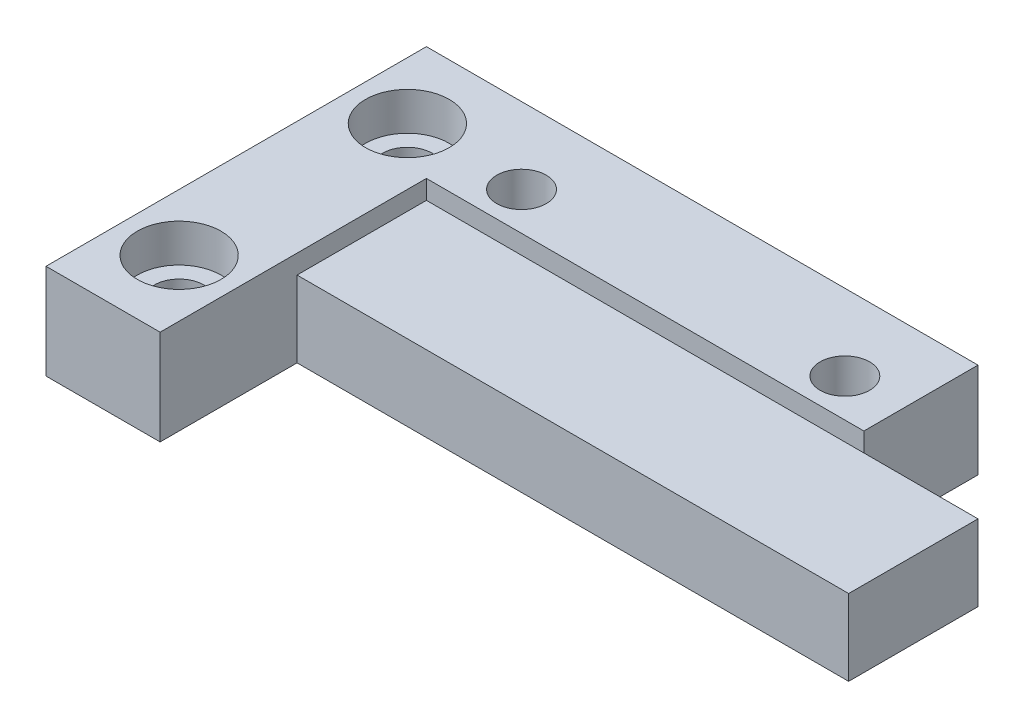
ISO-10303-21;
HEADER;
FILE_DESCRIPTION(('STEP AP214'),'2;1');
FILE_NAME('part.step','',(''),(''),'','','');
FILE_SCHEMA(('AUTOMOTIVE_DESIGN { 1 0 10303 214 1 1 1 1 }'));
ENDSEC;
DATA;
#1=APPLICATION_CONTEXT('core data for automotive mechanical design processes');
#2=APPLICATION_PROTOCOL_DEFINITION('international standard','automotive_design',2000,#1);
#3=PRODUCT_CONTEXT('',#1,'mechanical');
#4=PRODUCT('Part','Part','',(#3));
#5=PRODUCT_RELATED_PRODUCT_CATEGORY('part','',(#4));
#6=PRODUCT_DEFINITION_FORMATION('','',#4);
#7=PRODUCT_DEFINITION_CONTEXT('part definition',#1,'design');
#8=PRODUCT_DEFINITION('design','',#6,#7);
#9=PRODUCT_DEFINITION_SHAPE('','',#8);
#10=(LENGTH_UNIT() NAMED_UNIT(*) SI_UNIT(.MILLI.,.METRE.));
#11=(NAMED_UNIT(*) PLANE_ANGLE_UNIT() SI_UNIT($,.RADIAN.));
#12=(NAMED_UNIT(*) SI_UNIT($,.STERADIAN.) SOLID_ANGLE_UNIT());
#13=UNCERTAINTY_MEASURE_WITH_UNIT(LENGTH_MEASURE(1.E-05),#10,'distance_accuracy_value','');
#14=(GEOMETRIC_REPRESENTATION_CONTEXT(3) GLOBAL_UNCERTAINTY_ASSIGNED_CONTEXT((#13)) GLOBAL_UNIT_ASSIGNED_CONTEXT((#10,
#11,#12)) REPRESENTATION_CONTEXT('',''));
#15=CARTESIAN_POINT('',(0.,0.,0.));
#16=DIRECTION('',(0.,0.,1.));
#17=DIRECTION('',(1.,0.,0.));
#18=AXIS2_PLACEMENT_3D('',#15,#16,#17);
#19=CARTESIAN_POINT('',(3.,5.,-16.));
#20=DIRECTION('',(0.,-1.,0.));
#21=DIRECTION('',(0.,0.,-1.));
#22=AXIS2_PLACEMENT_3D('',#19,#20,#21);
#23=CYLINDRICAL_SURFACE('',#22,1.3);
#24=CARTESIAN_POINT('',(3.,8.,-16.));
#25=DIRECTION('',(0.,-1.,0.));
#26=DIRECTION('',(0.,0.,-1.));
#27=AXIS2_PLACEMENT_3D('',#24,#25,#26);
#28=CIRCLE('',#27,1.3);
#29=CARTESIAN_POINT('',(3.,8.,-17.3));
#30=VERTEX_POINT('',#29);
#31=EDGE_CURVE('E242',#30,#30,#28,.T.);
#32=ORIENTED_EDGE('',*,*,#31,.F.);
#33=EDGE_LOOP('',(#32));
#34=FACE_BOUND('',#33,.T.);
#35=CARTESIAN_POINT('',(3.,5.,-16.));
#36=DIRECTION('',(0.,-1.,0.));
#37=DIRECTION('',(0.,0.,-1.));
#38=AXIS2_PLACEMENT_3D('',#35,#36,#37);
#39=CIRCLE('',#38,1.3);
#40=CARTESIAN_POINT('',(3.,5.,-17.3));
#41=VERTEX_POINT('',#40);
#42=EDGE_CURVE('E338',#41,#41,#39,.T.);
#43=ORIENTED_EDGE('',*,*,#42,.T.);
#44=EDGE_LOOP('',(#43));
#45=FACE_BOUND('',#44,.T.);
#46=ADVANCED_FACE('F33',(#34,#45),#23,.F.);
#47=CARTESIAN_POINT('',(3.,5.,-4.));
#48=DIRECTION('',(0.,-1.,0.));
#49=DIRECTION('',(0.,0.,-1.));
#50=AXIS2_PLACEMENT_3D('',#47,#48,#49);
#51=CYLINDRICAL_SURFACE('',#50,1.3);
#52=CARTESIAN_POINT('',(3.,8.,-4.));
#53=DIRECTION('',(0.,-1.,0.));
#54=DIRECTION('',(0.,0.,-1.));
#55=AXIS2_PLACEMENT_3D('',#52,#53,#54);
#56=CIRCLE('',#55,1.3);
#57=CARTESIAN_POINT('',(3.,8.,-5.3));
#58=VERTEX_POINT('',#57);
#59=EDGE_CURVE('E247',#58,#58,#56,.T.);
#60=ORIENTED_EDGE('',*,*,#59,.F.);
#61=EDGE_LOOP('',(#60));
#62=FACE_BOUND('',#61,.T.);
#63=CARTESIAN_POINT('',(3.,5.,-4.));
#64=DIRECTION('',(0.,-1.,0.));
#65=DIRECTION('',(0.,0.,-1.));
#66=AXIS2_PLACEMENT_3D('',#63,#64,#65);
#67=CIRCLE('',#66,1.3);
#68=CARTESIAN_POINT('',(3.,5.,-5.3));
#69=VERTEX_POINT('',#68);
#70=EDGE_CURVE('E343',#69,#69,#67,.T.);
#71=ORIENTED_EDGE('',*,*,#70,.T.);
#72=EDGE_LOOP('',(#71));
#73=FACE_BOUND('',#72,.T.);
#74=ADVANCED_FACE('F423',(#62,#73),#51,.F.);
#75=CARTESIAN_POINT('',(35.,5.,0.));
#76=DIRECTION('',(-1.,0.,0.));
#77=DIRECTION('',(0.,0.,1.));
#78=AXIS2_PLACEMENT_3D('',#75,#76,#77);
#79=PLANE('',#78);
#80=DIRECTION('',(0.,0.,1.));
#81=VECTOR('',#80,1.);
#82=CARTESIAN_POINT('',(35.,5.,0.));
#83=LINE('',#82,#81);
#84=CARTESIAN_POINT('',(35.,5.,-14.));
#85=VERTEX_POINT('',#84);
#86=CARTESIAN_POINT('',(35.,5.,-7.2));
#87=VERTEX_POINT('',#86);
#88=EDGE_CURVE('E350',#85,#87,#83,.T.);
#89=ORIENTED_EDGE('',*,*,#88,.F.);
#90=DIRECTION('',(0.,-1.,0.));
#91=VECTOR('',#90,1.);
#92=CARTESIAN_POINT('',(35.,5.,-14.));
#93=LINE('',#92,#91);
#94=CARTESIAN_POINT('',(35.,9.,-14.));
#95=VERTEX_POINT('',#94);
#96=EDGE_CURVE('E214',#95,#85,#93,.T.);
#97=ORIENTED_EDGE('',*,*,#96,.F.);
#98=DIRECTION('',(0.,0.,-1.));
#99=VECTOR('',#98,1.);
#100=CARTESIAN_POINT('',(35.,9.,0.));
#101=LINE('',#100,#99);
#102=CARTESIAN_POINT('',(35.,9.,-7.2));
#103=VERTEX_POINT('',#102);
#104=EDGE_CURVE('E287',#103,#95,#101,.T.);
#105=ORIENTED_EDGE('',*,*,#104,.F.);
#106=DIRECTION('',(0.,-1.,0.));
#107=VECTOR('',#106,1.);
#108=CARTESIAN_POINT('',(35.,5.,-7.2));
#109=LINE('',#108,#107);
#110=EDGE_CURVE('E202',#103,#87,#109,.T.);
#111=ORIENTED_EDGE('',*,*,#110,.T.);
#112=EDGE_LOOP('',(#89,#97,#105,#111));
#113=FACE_BOUND('',#112,.T.);
#114=ADVANCED_FACE('F430',(#113),#79,.F.);
#115=CARTESIAN_POINT('',(0.,5.,-20.));
#116=DIRECTION('',(0.,0.,1.));
#117=DIRECTION('',(1.,0.,0.));
#118=AXIS2_PLACEMENT_3D('',#115,#116,#117);
#119=PLANE('',#118);
#120=DIRECTION('',(1.,0.,0.));
#121=VECTOR('',#120,1.);
#122=CARTESIAN_POINT('',(0.,5.,-20.));
#123=LINE('',#122,#121);
#124=CARTESIAN_POINT('',(0.,5.,-20.));
#125=VERTEX_POINT('',#124);
#126=CARTESIAN_POINT('',(29.,5.,-20.));
#127=VERTEX_POINT('',#126);
#128=EDGE_CURVE('E352',#125,#127,#123,.T.);
#129=ORIENTED_EDGE('',*,*,#128,.F.);
#130=DIRECTION('',(0.,-1.,0.));
#131=VECTOR('',#130,1.);
#132=CARTESIAN_POINT('',(0.,5.,-20.));
#133=LINE('',#132,#131);
#134=CARTESIAN_POINT('',(0.,10.,-20.));
#135=VERTEX_POINT('',#134);
#136=EDGE_CURVE('E192',#135,#125,#133,.T.);
#137=ORIENTED_EDGE('',*,*,#136,.F.);
#138=DIRECTION('',(-1.,0.,0.));
#139=VECTOR('',#138,1.);
#140=CARTESIAN_POINT('',(0.,10.,-20.));
#141=LINE('',#140,#139);
#142=CARTESIAN_POINT('',(29.,10.,-20.));
#143=VERTEX_POINT('',#142);
#144=EDGE_CURVE('E267',#143,#135,#141,.T.);
#145=ORIENTED_EDGE('',*,*,#144,.F.);
#146=DIRECTION('',(0.,-1.,0.));
#147=VECTOR('',#146,1.);
#148=CARTESIAN_POINT('',(29.,5.,-20.));
#149=LINE('',#148,#147);
#150=EDGE_CURVE('E208',#143,#127,#149,.T.);
#151=ORIENTED_EDGE('',*,*,#150,.T.);
#152=EDGE_LOOP('',(#129,#137,#145,#151));
#153=FACE_BOUND('',#152,.T.);
#154=ADVANCED_FACE('F454',(#153),#119,.F.);
#155=CARTESIAN_POINT('',(0.,5.,0.));
#156=DIRECTION('',(0.,0.,-1.));
#157=DIRECTION('',(-1.,0.,0.));
#158=AXIS2_PLACEMENT_3D('',#155,#156,#157);
#159=PLANE('',#158);
#160=DIRECTION('',(1.,0.,0.));
#161=VECTOR('',#160,1.);
#162=CARTESIAN_POINT('',(0.,5.,0.));
#163=LINE('',#162,#161);
#164=CARTESIAN_POINT('',(0.,5.,0.));
#165=VERTEX_POINT('',#164);
#166=CARTESIAN_POINT('',(6.,5.,0.));
#167=VERTEX_POINT('',#166);
#168=EDGE_CURVE('E176',#165,#167,#163,.T.);
#169=ORIENTED_EDGE('',*,*,#168,.T.);
#170=DIRECTION('',(0.,-1.,0.));
#171=VECTOR('',#170,1.);
#172=CARTESIAN_POINT('',(6.,1.,0.));
#173=LINE('',#172,#171);
#174=CARTESIAN_POINT('',(6.,10.,0.));
#175=VERTEX_POINT('',#174);
#176=EDGE_CURVE('E198',#175,#167,#173,.T.);
#177=ORIENTED_EDGE('',*,*,#176,.F.);
#178=DIRECTION('',(1.,0.,0.));
#179=VECTOR('',#178,1.);
#180=CARTESIAN_POINT('',(0.,10.,0.));
#181=LINE('',#180,#179);
#182=CARTESIAN_POINT('',(0.,10.,0.));
#183=VERTEX_POINT('',#182);
#184=EDGE_CURVE('E196',#183,#175,#181,.T.);
#185=ORIENTED_EDGE('',*,*,#184,.F.);
#186=DIRECTION('',(0.,-1.,0.));
#187=VECTOR('',#186,1.);
#188=CARTESIAN_POINT('',(0.,5.,0.));
#189=LINE('',#188,#187);
#190=EDGE_CURVE('E41',#183,#165,#189,.T.);
#191=ORIENTED_EDGE('',*,*,#190,.T.);
#192=EDGE_LOOP('',(#169,#177,#185,#191));
#193=FACE_BOUND('',#192,.T.);
#194=ADVANCED_FACE('F194',(#193),#159,.F.);
#195=CARTESIAN_POINT('',(0.,5.,0.));
#196=DIRECTION('',(1.,0.,0.));
#197=DIRECTION('',(0.,0.,-1.));
#198=AXIS2_PLACEMENT_3D('',#195,#196,#197);
#199=PLANE('',#198);
#200=DIRECTION('',(0.,0.,1.));
#201=VECTOR('',#200,1.);
#202=CARTESIAN_POINT('',(0.,5.,0.));
#203=LINE('',#202,#201);
#204=EDGE_CURVE('E179',#125,#165,#203,.T.);
#205=ORIENTED_EDGE('',*,*,#204,.T.);
#206=ORIENTED_EDGE('',*,*,#190,.F.);
#207=DIRECTION('',(0.,0.,1.));
#208=VECTOR('',#207,1.);
#209=CARTESIAN_POINT('',(0.,10.,0.));
#210=LINE('',#209,#208);
#211=EDGE_CURVE('E271',#135,#183,#210,.T.);
#212=ORIENTED_EDGE('',*,*,#211,.F.);
#213=ORIENTED_EDGE('',*,*,#136,.T.);
#214=EDGE_LOOP('',(#205,#206,#212,#213));
#215=FACE_BOUND('',#214,.T.);
#216=ADVANCED_FACE('F35',(#215),#199,.F.);
#217=CARTESIAN_POINT('',(6.,1.,0.));
#218=DIRECTION('',(1.,0.,0.));
#219=DIRECTION('',(0.,0.,-1.));
#220=AXIS2_PLACEMENT_3D('',#217,#218,#219);
#221=PLANE('',#220);
#222=ORIENTED_EDGE('',*,*,#176,.T.);
#223=DIRECTION('',(0.,0.,-1.));
#224=VECTOR('',#223,1.);
#225=CARTESIAN_POINT('',(6.,5.,0.));
#226=LINE('',#225,#224);
#227=CARTESIAN_POINT('',(6.,5.,-7.2));
#228=VERTEX_POINT('',#227);
#229=EDGE_CURVE('E182',#167,#228,#226,.T.);
#230=ORIENTED_EDGE('',*,*,#229,.T.);
#231=DIRECTION('',(0.,-1.,0.));
#232=VECTOR('',#231,1.);
#233=CARTESIAN_POINT('',(6.,5.,-7.2));
#234=LINE('',#233,#232);
#235=CARTESIAN_POINT('',(6.,9.,-7.2));
#236=VERTEX_POINT('',#235);
#237=EDGE_CURVE('E205',#236,#228,#234,.T.);
#238=ORIENTED_EDGE('',*,*,#237,.F.);
#239=DIRECTION('',(0.,0.,1.));
#240=VECTOR('',#239,1.);
#241=CARTESIAN_POINT('',(6.,9.,0.));
#242=LINE('',#241,#240);
#243=CARTESIAN_POINT('',(6.,9.,-14.));
#244=VERTEX_POINT('',#243);
#245=EDGE_CURVE('E279',#244,#236,#242,.T.);
#246=ORIENTED_EDGE('',*,*,#245,.F.);
#247=DIRECTION('',(0.,1.,0.));
#248=VECTOR('',#247,1.);
#249=CARTESIAN_POINT('',(6.,9.,-14.));
#250=LINE('',#249,#248);
#251=CARTESIAN_POINT('',(6.,10.,-14.));
#252=VERTEX_POINT('',#251);
#253=EDGE_CURVE('E273',#244,#252,#250,.T.);
#254=ORIENTED_EDGE('',*,*,#253,.T.);
#255=DIRECTION('',(0.,0.,1.));
#256=VECTOR('',#255,1.);
#257=CARTESIAN_POINT('',(6.,10.,0.));
#258=LINE('',#257,#256);
#259=EDGE_CURVE('E280',#252,#175,#258,.T.);
#260=ORIENTED_EDGE('',*,*,#259,.T.);
#261=EDGE_LOOP('',(#222,#230,#238,#246,#254,#260));
#262=FACE_BOUND('',#261,.T.);
#263=ADVANCED_FACE('F449',(#262),#221,.T.);
#264=CARTESIAN_POINT('',(6.,5.,-7.2));
#265=DIRECTION('',(0.,0.,1.));
#266=DIRECTION('',(1.,0.,0.));
#267=AXIS2_PLACEMENT_3D('',#264,#265,#266);
#268=PLANE('',#267);
#269=ORIENTED_EDGE('',*,*,#237,.T.);
#270=DIRECTION('',(1.,0.,0.));
#271=VECTOR('',#270,1.);
#272=CARTESIAN_POINT('',(6.,5.,-7.2));
#273=LINE('',#272,#271);
#274=EDGE_CURVE('E347',#228,#87,#273,.T.);
#275=ORIENTED_EDGE('',*,*,#274,.T.);
#276=ORIENTED_EDGE('',*,*,#110,.F.);
#277=DIRECTION('',(-1.,0.,0.));
#278=VECTOR('',#277,1.);
#279=CARTESIAN_POINT('',(0.,9.,-7.2));
#280=LINE('',#279,#278);
#281=EDGE_CURVE('E264',#103,#236,#280,.T.);
#282=ORIENTED_EDGE('',*,*,#281,.T.);
#283=EDGE_LOOP('',(#269,#275,#276,#282));
#284=FACE_BOUND('',#283,.T.);
#285=ADVANCED_FACE('F445',(#284),#268,.T.);
#286=CARTESIAN_POINT('',(29.,5.,-20.));
#287=DIRECTION('',(1.,0.,0.));
#288=DIRECTION('',(0.,0.,-1.));
#289=AXIS2_PLACEMENT_3D('',#286,#287,#288);
#290=PLANE('',#289);
#291=DIRECTION('',(0.,-1.,0.));
#292=VECTOR('',#291,1.);
#293=CARTESIAN_POINT('',(29.,5.,-14.));
#294=LINE('',#293,#292);
#295=CARTESIAN_POINT('',(29.,9.,-14.));
#296=VERTEX_POINT('',#295);
#297=CARTESIAN_POINT('',(29.,5.,-14.));
#298=VERTEX_POINT('',#297);
#299=EDGE_CURVE('E211',#296,#298,#294,.T.);
#300=ORIENTED_EDGE('',*,*,#299,.T.);
#301=DIRECTION('',(0.,0.,-1.));
#302=VECTOR('',#301,1.);
#303=CARTESIAN_POINT('',(29.,5.,-20.));
#304=LINE('',#303,#302);
#305=EDGE_CURVE('E48',#298,#127,#304,.T.);
#306=ORIENTED_EDGE('',*,*,#305,.T.);
#307=ORIENTED_EDGE('',*,*,#150,.F.);
#308=DIRECTION('',(0.,0.,1.));
#309=VECTOR('',#308,1.);
#310=CARTESIAN_POINT('',(29.,10.,-20.));
#311=LINE('',#310,#309);
#312=CARTESIAN_POINT('',(29.,10.,-14.));
#313=VERTEX_POINT('',#312);
#314=EDGE_CURVE('E283',#143,#313,#311,.T.);
#315=ORIENTED_EDGE('',*,*,#314,.T.);
#316=DIRECTION('',(0.,-1.,0.));
#317=VECTOR('',#316,1.);
#318=CARTESIAN_POINT('',(29.,9.,-14.));
#319=LINE('',#318,#317);
#320=EDGE_CURVE('E233',#313,#296,#319,.T.);
#321=ORIENTED_EDGE('',*,*,#320,.T.);
#322=EDGE_LOOP('',(#300,#306,#307,#315,#321));
#323=FACE_BOUND('',#322,.T.);
#324=ADVANCED_FACE('F441',(#323),#290,.T.);
#325=CARTESIAN_POINT('',(35.,5.,-14.));
#326=DIRECTION('',(0.,0.,-1.));
#327=DIRECTION('',(-1.,0.,0.));
#328=AXIS2_PLACEMENT_3D('',#325,#326,#327);
#329=PLANE('',#328);
#330=ORIENTED_EDGE('',*,*,#96,.T.);
#331=DIRECTION('',(-1.,0.,0.));
#332=VECTOR('',#331,1.);
#333=CARTESIAN_POINT('',(35.,5.,-14.));
#334=LINE('',#333,#332);
#335=EDGE_CURVE('E355',#85,#298,#334,.T.);
#336=ORIENTED_EDGE('',*,*,#335,.T.);
#337=ORIENTED_EDGE('',*,*,#299,.F.);
#338=DIRECTION('',(-1.,0.,0.));
#339=VECTOR('',#338,1.);
#340=CARTESIAN_POINT('',(6.,9.,-14.));
#341=LINE('',#340,#339);
#342=EDGE_CURVE('E275',#95,#296,#341,.T.);
#343=ORIENTED_EDGE('',*,*,#342,.F.);
#344=EDGE_LOOP('',(#330,#336,#337,#343));
#345=FACE_BOUND('',#344,.T.);
#346=ADVANCED_FACE('F437',(#345),#329,.T.);
#347=CARTESIAN_POINT('',(10.2174337148169,2.7,-17.69711431703));
#348=DIRECTION('',(0.500000000000002,0.,-0.866025403784438));
#349=DIRECTION('',(-0.866025403784438,0.,-0.500000000000002));
#350=AXIS2_PLACEMENT_3D('',#347,#348,#349);
#351=PLANE('',#350);
#352=DIRECTION('',(-0.866025403784438,0.,-0.500000000000002));
#353=VECTOR('',#352,1.);
#354=CARTESIAN_POINT('',(10.2174337148169,5.,-17.69711431703));
#355=LINE('',#354,#353);
#356=CARTESIAN_POINT('',(11.0784609690827,5.,-17.2));
#357=VERTEX_POINT('',#356);
#358=CARTESIAN_POINT('',(9.00000000000001,5.,-18.4));
#359=VERTEX_POINT('',#358);
#360=EDGE_CURVE('E56',#357,#359,#355,.T.);
#361=ORIENTED_EDGE('',*,*,#360,.F.);
#362=DIRECTION('',(0.,1.,0.));
#363=VECTOR('',#362,1.);
#364=CARTESIAN_POINT('',(11.0784609690827,2.7,-17.2));
#365=LINE('',#364,#363);
#366=CARTESIAN_POINT('',(11.0784609690827,7.3,-17.2));
#367=VERTEX_POINT('',#366);
#368=EDGE_CURVE('E217',#357,#367,#365,.T.);
#369=ORIENTED_EDGE('',*,*,#368,.T.);
#370=DIRECTION('',(-0.866025403784438,0.,-0.500000000000002));
#371=VECTOR('',#370,1.);
#372=CARTESIAN_POINT('',(10.2174337148169,7.3,-17.69711431703));
#373=LINE('',#372,#371);
#374=CARTESIAN_POINT('',(9.00000000000001,7.3,-18.4));
#375=VERTEX_POINT('',#374);
#376=EDGE_CURVE('E255',#367,#375,#373,.T.);
#377=ORIENTED_EDGE('',*,*,#376,.T.);
#378=DIRECTION('',(0.,1.,0.));
#379=VECTOR('',#378,1.);
#380=CARTESIAN_POINT('',(9.00000000000001,2.7,-18.4));
#381=LINE('',#380,#379);
#382=EDGE_CURVE('E218',#359,#375,#381,.T.);
#383=ORIENTED_EDGE('',*,*,#382,.F.);
#384=EDGE_LOOP('',(#361,#369,#377,#383));
#385=FACE_BOUND('',#384,.T.);
#386=ADVANCED_FACE('F440',(#385),#351,.F.);
#387=CARTESIAN_POINT('',(11.0784609690827,2.7,0.));
#388=DIRECTION('',(1.,0.,0.));
#389=DIRECTION('',(0.,0.,-1.));
#390=AXIS2_PLACEMENT_3D('',#387,#388,#389);
#391=PLANE('',#390);
#392=DIRECTION('',(0.,0.,-1.));
#393=VECTOR('',#392,1.);
#394=CARTESIAN_POINT('',(11.0784609690827,5.,0.));
#395=LINE('',#394,#393);
#396=CARTESIAN_POINT('',(11.0784609690827,5.,-14.8));
#397=VERTEX_POINT('',#396);
#398=EDGE_CURVE('E358',#397,#357,#395,.T.);
#399=ORIENTED_EDGE('',*,*,#398,.F.);
#400=DIRECTION('',(0.,1.,0.));
#401=VECTOR('',#400,1.);
#402=CARTESIAN_POINT('',(11.0784609690827,2.7,-14.8));
#403=LINE('',#402,#401);
#404=CARTESIAN_POINT('',(11.0784609690827,7.3,-14.8));
#405=VERTEX_POINT('',#404);
#406=EDGE_CURVE('E227',#397,#405,#403,.T.);
#407=ORIENTED_EDGE('',*,*,#406,.T.);
#408=DIRECTION('',(0.,0.,-1.));
#409=VECTOR('',#408,1.);
#410=CARTESIAN_POINT('',(11.0784609690827,7.3,0.));
#411=LINE('',#410,#409);
#412=EDGE_CURVE('E261',#405,#367,#411,.T.);
#413=ORIENTED_EDGE('',*,*,#412,.T.);
#414=ORIENTED_EDGE('',*,*,#368,.F.);
#415=EDGE_LOOP('',(#399,#407,#413,#414));
#416=FACE_BOUND('',#415,.T.);
#417=ADVANCED_FACE('F493',(#416),#391,.F.);
#418=CARTESIAN_POINT('',(-3.63897274573418,2.7,-6.30288568297002));
#419=DIRECTION('',(0.5,0.,0.866025403784439));
#420=DIRECTION('',(0.866025403784439,0.,-0.5));
#421=AXIS2_PLACEMENT_3D('',#418,#419,#420);
#422=PLANE('',#421);
#423=DIRECTION('',(0.866025403784439,0.,-0.5));
#424=VECTOR('',#423,1.);
#425=CARTESIAN_POINT('',(-3.63897274573418,5.,-6.30288568297002));
#426=LINE('',#425,#424);
#427=CARTESIAN_POINT('',(9.,5.,-13.6));
#428=VERTEX_POINT('',#427);
#429=EDGE_CURVE('E360',#428,#397,#426,.T.);
#430=ORIENTED_EDGE('',*,*,#429,.F.);
#431=DIRECTION('',(0.,1.,0.));
#432=VECTOR('',#431,1.);
#433=CARTESIAN_POINT('',(9.,2.7,-13.6));
#434=LINE('',#433,#432);
#435=CARTESIAN_POINT('',(9.,7.3,-13.6));
#436=VERTEX_POINT('',#435);
#437=EDGE_CURVE('E225',#428,#436,#434,.T.);
#438=ORIENTED_EDGE('',*,*,#437,.T.);
#439=DIRECTION('',(0.866025403784439,0.,-0.5));
#440=VECTOR('',#439,1.);
#441=CARTESIAN_POINT('',(-3.63897274573418,7.3,-6.30288568297002));
#442=LINE('',#441,#440);
#443=EDGE_CURVE('E301',#436,#405,#442,.T.);
#444=ORIENTED_EDGE('',*,*,#443,.T.);
#445=ORIENTED_EDGE('',*,*,#406,.F.);
#446=EDGE_LOOP('',(#430,#438,#444,#445));
#447=FACE_BOUND('',#446,.T.);
#448=ADVANCED_FACE('F501',(#447),#422,.F.);
#449=CARTESIAN_POINT('',(8.13897274573419,2.7,-14.09711431703));
#450=DIRECTION('',(-0.5,0.,0.866025403784438));
#451=DIRECTION('',(0.866025403784438,0.,0.5));
#452=AXIS2_PLACEMENT_3D('',#449,#450,#451);
#453=PLANE('',#452);
#454=DIRECTION('',(0.866025403784438,0.,0.5));
#455=VECTOR('',#454,1.);
#456=CARTESIAN_POINT('',(8.13897274573419,5.,-14.09711431703));
#457=LINE('',#456,#455);
#458=CARTESIAN_POINT('',(6.92153903091735,5.,-14.8));
#459=VERTEX_POINT('',#458);
#460=EDGE_CURVE('E362',#459,#428,#457,.T.);
#461=ORIENTED_EDGE('',*,*,#460,.F.);
#462=DIRECTION('',(0.,1.,0.));
#463=VECTOR('',#462,1.);
#464=CARTESIAN_POINT('',(6.92153903091735,2.7,-14.8));
#465=LINE('',#464,#463);
#466=CARTESIAN_POINT('',(6.92153903091735,7.3,-14.8));
#467=VERTEX_POINT('',#466);
#468=EDGE_CURVE('E223',#459,#467,#465,.T.);
#469=ORIENTED_EDGE('',*,*,#468,.T.);
#470=DIRECTION('',(0.866025403784438,0.,0.5));
#471=VECTOR('',#470,1.);
#472=CARTESIAN_POINT('',(8.13897274573419,7.3,-14.09711431703));
#473=LINE('',#472,#471);
#474=EDGE_CURVE('E304',#467,#436,#473,.T.);
#475=ORIENTED_EDGE('',*,*,#474,.T.);
#476=ORIENTED_EDGE('',*,*,#437,.F.);
#477=EDGE_LOOP('',(#461,#469,#475,#476));
#478=FACE_BOUND('',#477,.T.);
#479=ADVANCED_FACE('F510',(#478),#453,.F.);
#480=CARTESIAN_POINT('',(6.92153903091735,2.7,0.));
#481=DIRECTION('',(-1.,0.,0.));
#482=DIRECTION('',(0.,0.,1.));
#483=AXIS2_PLACEMENT_3D('',#480,#481,#482);
#484=PLANE('',#483);
#485=DIRECTION('',(0.,0.,1.));
#486=VECTOR('',#485,1.);
#487=CARTESIAN_POINT('',(6.92153903091735,5.,0.));
#488=LINE('',#487,#486);
#489=CARTESIAN_POINT('',(6.92153903091735,5.,-17.2));
#490=VERTEX_POINT('',#489);
#491=EDGE_CURVE('E364',#490,#459,#488,.T.);
#492=ORIENTED_EDGE('',*,*,#491,.F.);
#493=DIRECTION('',(0.,1.,0.));
#494=VECTOR('',#493,1.);
#495=CARTESIAN_POINT('',(6.92153903091735,2.7,-17.2));
#496=LINE('',#495,#494);
#497=CARTESIAN_POINT('',(6.92153903091735,7.3,-17.2));
#498=VERTEX_POINT('',#497);
#499=EDGE_CURVE('E220',#490,#498,#496,.T.);
#500=ORIENTED_EDGE('',*,*,#499,.T.);
#501=DIRECTION('',(0.,0.,1.));
#502=VECTOR('',#501,1.);
#503=CARTESIAN_POINT('',(6.92153903091735,7.3,0.));
#504=LINE('',#503,#502);
#505=EDGE_CURVE('E307',#498,#467,#504,.T.);
#506=ORIENTED_EDGE('',*,*,#505,.T.);
#507=ORIENTED_EDGE('',*,*,#468,.F.);
#508=EDGE_LOOP('',(#492,#500,#506,#507));
#509=FACE_BOUND('',#508,.T.);
#510=ADVANCED_FACE('F519',(#509),#484,.F.);
#511=CARTESIAN_POINT('',(-5.71743371481683,2.7,-9.90288568297003));
#512=DIRECTION('',(-0.5,0.,-0.866025403784439));
#513=DIRECTION('',(-0.866025403784439,0.,0.5));
#514=AXIS2_PLACEMENT_3D('',#511,#512,#513);
#515=PLANE('',#514);
#516=DIRECTION('',(-0.866025403784439,0.,0.5));
#517=VECTOR('',#516,1.);
#518=CARTESIAN_POINT('',(-5.71743371481683,5.,-9.90288568297003));
#519=LINE('',#518,#517);
#520=EDGE_CURVE('E366',#359,#490,#519,.T.);
#521=ORIENTED_EDGE('',*,*,#520,.F.);
#522=ORIENTED_EDGE('',*,*,#382,.T.);
#523=DIRECTION('',(-0.866025403784439,0.,0.5));
#524=VECTOR('',#523,1.);
#525=CARTESIAN_POINT('',(-5.71743371481683,7.3,-9.90288568297003));
#526=LINE('',#525,#524);
#527=EDGE_CURVE('E310',#375,#498,#526,.T.);
#528=ORIENTED_EDGE('',*,*,#527,.T.);
#529=ORIENTED_EDGE('',*,*,#499,.F.);
#530=EDGE_LOOP('',(#521,#522,#528,#529));
#531=FACE_BOUND('',#530,.T.);
#532=ADVANCED_FACE('F528',(#531),#515,.F.);
#533=CARTESIAN_POINT('',(14.4674337148168,2.7,-25.0583302491977));
#534=DIRECTION('',(0.499999999999999,0.,-0.866025403784439));
#535=DIRECTION('',(-0.866025403784439,0.,-0.499999999999999));
#536=AXIS2_PLACEMENT_3D('',#533,#534,#535);
#537=PLANE('',#536);
#538=DIRECTION('',(-0.866025403784439,0.,-0.499999999999999));
#539=VECTOR('',#538,1.);
#540=CARTESIAN_POINT('',(14.4674337148168,5.,-25.0583302491977));
#541=LINE('',#540,#539);
#542=CARTESIAN_POINT('',(28.0784609690827,5.,-17.2));
#543=VERTEX_POINT('',#542);
#544=CARTESIAN_POINT('',(26.,5.,-18.4));
#545=VERTEX_POINT('',#544);
#546=EDGE_CURVE('E368',#543,#545,#541,.T.);
#547=ORIENTED_EDGE('',*,*,#546,.F.);
#548=DIRECTION('',(0.,1.,0.));
#549=VECTOR('',#548,1.);
#550=CARTESIAN_POINT('',(28.0784609690827,2.7,-17.2));
#551=LINE('',#550,#549);
#552=CARTESIAN_POINT('',(28.0784609690827,7.3,-17.2));
#553=VERTEX_POINT('',#552);
#554=EDGE_CURVE('E221',#543,#553,#551,.T.);
#555=ORIENTED_EDGE('',*,*,#554,.T.);
#556=DIRECTION('',(-0.866025403784439,0.,-0.499999999999999));
#557=VECTOR('',#556,1.);
#558=CARTESIAN_POINT('',(14.4674337148168,7.3,-25.0583302491977));
#559=LINE('',#558,#557);
#560=CARTESIAN_POINT('',(26.,7.3,-18.4));
#561=VERTEX_POINT('',#560);
#562=EDGE_CURVE('E250',#553,#561,#559,.T.);
#563=ORIENTED_EDGE('',*,*,#562,.T.);
#564=DIRECTION('',(0.,1.,0.));
#565=VECTOR('',#564,1.);
#566=CARTESIAN_POINT('',(26.,2.7,-18.4));
#567=LINE('',#566,#565);
#568=EDGE_CURVE('E230',#545,#561,#567,.T.);
#569=ORIENTED_EDGE('',*,*,#568,.F.);
#570=EDGE_LOOP('',(#547,#555,#563,#569));
#571=FACE_BOUND('',#570,.T.);
#572=ADVANCED_FACE('F405',(#571),#537,.F.);
#573=CARTESIAN_POINT('',(28.0784609690827,2.7,0.));
#574=DIRECTION('',(1.,0.,0.));
#575=DIRECTION('',(0.,0.,-1.));
#576=AXIS2_PLACEMENT_3D('',#573,#574,#575);
#577=PLANE('',#576);
#578=DIRECTION('',(0.,0.,-1.));
#579=VECTOR('',#578,1.);
#580=CARTESIAN_POINT('',(28.0784609690827,5.,0.));
#581=LINE('',#580,#579);
#582=CARTESIAN_POINT('',(28.0784609690827,5.,-14.8));
#583=VERTEX_POINT('',#582);
#584=EDGE_CURVE('E370',#583,#543,#581,.T.);
#585=ORIENTED_EDGE('',*,*,#584,.F.);
#586=DIRECTION('',(0.,1.,0.));
#587=VECTOR('',#586,1.);
#588=CARTESIAN_POINT('',(28.0784609690827,2.7,-14.8));
#589=LINE('',#588,#587);
#590=CARTESIAN_POINT('',(28.0784609690827,7.3,-14.8));
#591=VERTEX_POINT('',#590);
#592=EDGE_CURVE('E239',#583,#591,#589,.T.);
#593=ORIENTED_EDGE('',*,*,#592,.T.);
#594=DIRECTION('',(0.,0.,-1.));
#595=VECTOR('',#594,1.);
#596=CARTESIAN_POINT('',(28.0784609690827,7.3,0.));
#597=LINE('',#596,#595);
#598=EDGE_CURVE('E256',#591,#553,#597,.T.);
#599=ORIENTED_EDGE('',*,*,#598,.T.);
#600=ORIENTED_EDGE('',*,*,#554,.F.);
#601=EDGE_LOOP('',(#585,#593,#599,#600));
#602=FACE_BOUND('',#601,.T.);
#603=ADVANCED_FACE('F403',(#602),#577,.F.);
#604=CARTESIAN_POINT('',(0.611027254265821,2.7,1.05833024919771));
#605=DIRECTION('',(0.5,0.,0.866025403784439));
#606=DIRECTION('',(0.866025403784439,0.,-0.5));
#607=AXIS2_PLACEMENT_3D('',#604,#605,#606);
#608=PLANE('',#607);
#609=DIRECTION('',(0.866025403784439,0.,-0.5));
#610=VECTOR('',#609,1.);
#611=CARTESIAN_POINT('',(0.611027254265821,5.,1.05833024919771));
#612=LINE('',#611,#610);
#613=CARTESIAN_POINT('',(26.,5.,-13.6));
#614=VERTEX_POINT('',#613);
#615=EDGE_CURVE('E372',#614,#583,#612,.T.);
#616=ORIENTED_EDGE('',*,*,#615,.F.);
#617=DIRECTION('',(0.,1.,0.));
#618=VECTOR('',#617,1.);
#619=CARTESIAN_POINT('',(26.,2.7,-13.6));
#620=LINE('',#619,#618);
#621=CARTESIAN_POINT('',(26.,7.3,-13.6));
#622=VERTEX_POINT('',#621);
#623=EDGE_CURVE('E237',#614,#622,#620,.T.);
#624=ORIENTED_EDGE('',*,*,#623,.T.);
#625=DIRECTION('',(0.866025403784439,0.,-0.5));
#626=VECTOR('',#625,1.);
#627=CARTESIAN_POINT('',(0.611027254265821,7.3,1.05833024919771));
#628=LINE('',#627,#626);
#629=EDGE_CURVE('E317',#622,#591,#628,.T.);
#630=ORIENTED_EDGE('',*,*,#629,.T.);
#631=ORIENTED_EDGE('',*,*,#592,.F.);
#632=EDGE_LOOP('',(#616,#624,#630,#631));
#633=FACE_BOUND('',#632,.T.);
#634=ADVANCED_FACE('F398',(#633),#608,.F.);
#635=CARTESIAN_POINT('',(12.3889727457342,2.7,-21.4583302491977));
#636=DIRECTION('',(-0.499999999999999,0.,0.866025403784439));
#637=DIRECTION('',(0.866025403784439,0.,0.499999999999999));
#638=AXIS2_PLACEMENT_3D('',#635,#636,#637);
#639=PLANE('',#638);
#640=DIRECTION('',(0.866025403784439,0.,0.499999999999999));
#641=VECTOR('',#640,1.);
#642=CARTESIAN_POINT('',(12.3889727457342,5.,-21.4583302491977));
#643=LINE('',#642,#641);
#644=CARTESIAN_POINT('',(23.9215390309173,5.,-14.8));
#645=VERTEX_POINT('',#644);
#646=EDGE_CURVE('E374',#645,#614,#643,.T.);
#647=ORIENTED_EDGE('',*,*,#646,.F.);
#648=DIRECTION('',(0.,1.,0.));
#649=VECTOR('',#648,1.);
#650=CARTESIAN_POINT('',(23.9215390309174,2.7,-14.8));
#651=LINE('',#650,#649);
#652=CARTESIAN_POINT('',(23.9215390309174,7.3,-14.8));
#653=VERTEX_POINT('',#652);
#654=EDGE_CURVE('E235',#645,#653,#651,.T.);
#655=ORIENTED_EDGE('',*,*,#654,.T.);
#656=DIRECTION('',(0.866025403784439,0.,0.5));
#657=VECTOR('',#656,1.);
#658=CARTESIAN_POINT('',(12.3889727457342,7.3,-21.4583302491977));
#659=LINE('',#658,#657);
#660=EDGE_CURVE('E320',#653,#622,#659,.T.);
#661=ORIENTED_EDGE('',*,*,#660,.T.);
#662=ORIENTED_EDGE('',*,*,#623,.F.);
#663=EDGE_LOOP('',(#647,#655,#661,#662));
#664=FACE_BOUND('',#663,.T.);
#665=ADVANCED_FACE('F386',(#664),#639,.F.);
#666=CARTESIAN_POINT('',(23.9215390309173,2.7,0.));
#667=DIRECTION('',(-1.,0.,0.));
#668=DIRECTION('',(0.,0.,1.));
#669=AXIS2_PLACEMENT_3D('',#666,#667,#668);
#670=PLANE('',#669);
#671=DIRECTION('',(0.,0.,1.));
#672=VECTOR('',#671,1.);
#673=CARTESIAN_POINT('',(23.9215390309173,5.,0.));
#674=LINE('',#673,#672);
#675=CARTESIAN_POINT('',(23.9215390309173,5.,-17.2));
#676=VERTEX_POINT('',#675);
#677=EDGE_CURVE('E186',#676,#645,#674,.T.);
#678=ORIENTED_EDGE('',*,*,#677,.F.);
#679=DIRECTION('',(0.,1.,0.));
#680=VECTOR('',#679,1.);
#681=CARTESIAN_POINT('',(23.9215390309173,2.7,-17.2));
#682=LINE('',#681,#680);
#683=CARTESIAN_POINT('',(23.9215390309173,7.3,-17.2));
#684=VERTEX_POINT('',#683);
#685=EDGE_CURVE('E232',#676,#684,#682,.T.);
#686=ORIENTED_EDGE('',*,*,#685,.T.);
#687=DIRECTION('',(0.,0.,1.));
#688=VECTOR('',#687,1.);
#689=CARTESIAN_POINT('',(23.9215390309173,7.3,0.));
#690=LINE('',#689,#688);
#691=EDGE_CURVE('E323',#684,#653,#690,.T.);
#692=ORIENTED_EDGE('',*,*,#691,.T.);
#693=ORIENTED_EDGE('',*,*,#654,.F.);
#694=EDGE_LOOP('',(#678,#686,#692,#693));
#695=FACE_BOUND('',#694,.T.);
#696=ADVANCED_FACE('F387',(#695),#670,.F.);
#697=CARTESIAN_POINT('',(-1.46743371481683,2.7,-2.5416697508023));
#698=DIRECTION('',(-0.5,0.,-0.866025403784439));
#699=DIRECTION('',(-0.866025403784439,0.,0.5));
#700=AXIS2_PLACEMENT_3D('',#697,#698,#699);
#701=PLANE('',#700);
#702=DIRECTION('',(-0.866025403784439,0.,0.5));
#703=VECTOR('',#702,1.);
#704=CARTESIAN_POINT('',(-1.46743371481683,5.,-2.5416697508023));
#705=LINE('',#704,#703);
#706=EDGE_CURVE('E11',#545,#676,#705,.T.);
#707=ORIENTED_EDGE('',*,*,#706,.F.);
#708=ORIENTED_EDGE('',*,*,#568,.T.);
#709=DIRECTION('',(-0.866025403784439,0.,0.5));
#710=VECTOR('',#709,1.);
#711=CARTESIAN_POINT('',(-1.46743371481683,7.3,-2.5416697508023));
#712=LINE('',#711,#710);
#713=EDGE_CURVE('E326',#561,#684,#712,.T.);
#714=ORIENTED_EDGE('',*,*,#713,.T.);
#715=ORIENTED_EDGE('',*,*,#685,.F.);
#716=EDGE_LOOP('',(#707,#708,#714,#715));
#717=FACE_BOUND('',#716,.T.);
#718=ADVANCED_FACE('F408',(#717),#701,.F.);
#719=CARTESIAN_POINT('',(26.,5.,-16.));
#720=DIRECTION('',(0.,1.,0.));
#721=DIRECTION('',(0.,0.,-1.));
#722=AXIS2_PLACEMENT_3D('',#719,#720,#721);
#723=CYLINDRICAL_SURFACE('',#722,1.3);
#724=CARTESIAN_POINT('',(26.,10.,-16.));
#725=DIRECTION('',(0.,1.,0.));
#726=DIRECTION('',(0.,0.,1.));
#727=AXIS2_PLACEMENT_3D('',#724,#725,#726);
#728=CIRCLE('',#727,1.3);
#729=CARTESIAN_POINT('',(26.,10.,-14.7));
#730=VERTEX_POINT('',#729);
#731=EDGE_CURVE('E260',#730,#730,#728,.T.);
#732=ORIENTED_EDGE('',*,*,#731,.T.);
#733=EDGE_LOOP('',(#732));
#734=FACE_BOUND('',#733,.T.);
#735=CARTESIAN_POINT('',(26.,7.3,-16.));
#736=DIRECTION('',(0.,1.,0.));
#737=DIRECTION('',(0.,0.,1.));
#738=AXIS2_PLACEMENT_3D('',#735,#736,#737);
#739=CIRCLE('',#738,1.3);
#740=CARTESIAN_POINT('',(26.,7.3,-14.7));
#741=VERTEX_POINT('',#740);
#742=EDGE_CURVE('E252',#741,#741,#739,.T.);
#743=ORIENTED_EDGE('',*,*,#742,.F.);
#744=EDGE_LOOP('',(#743));
#745=FACE_BOUND('',#744,.T.);
#746=ADVANCED_FACE('F410',(#734,#745),#723,.F.);
#747=CARTESIAN_POINT('',(9.,5.,-16.));
#748=DIRECTION('',(0.,1.,0.));
#749=DIRECTION('',(0.,0.,-1.));
#750=AXIS2_PLACEMENT_3D('',#747,#748,#749);
#751=CYLINDRICAL_SURFACE('',#750,1.3);
#752=CARTESIAN_POINT('',(9.,10.,-16.));
#753=DIRECTION('',(0.,1.,0.));
#754=DIRECTION('',(0.,0.,1.));
#755=AXIS2_PLACEMENT_3D('',#752,#753,#754);
#756=CIRCLE('',#755,1.3);
#757=CARTESIAN_POINT('',(9.,10.,-14.7));
#758=VERTEX_POINT('',#757);
#759=EDGE_CURVE('E294',#758,#758,#756,.T.);
#760=ORIENTED_EDGE('',*,*,#759,.T.);
#761=EDGE_LOOP('',(#760));
#762=FACE_BOUND('',#761,.T.);
#763=CARTESIAN_POINT('',(9.,7.3,-16.));
#764=DIRECTION('',(0.,1.,0.));
#765=DIRECTION('',(0.,0.,1.));
#766=AXIS2_PLACEMENT_3D('',#763,#764,#765);
#767=CIRCLE('',#766,1.3);
#768=CARTESIAN_POINT('',(9.,7.3,-14.7));
#769=VERTEX_POINT('',#768);
#770=EDGE_CURVE('E257',#769,#769,#767,.T.);
#771=ORIENTED_EDGE('',*,*,#770,.F.);
#772=EDGE_LOOP('',(#771));
#773=FACE_BOUND('',#772,.T.);
#774=ADVANCED_FACE('F417',(#762,#773),#751,.F.);
#775=CARTESIAN_POINT('',(0.,10.,0.));
#776=DIRECTION('',(0.,1.,0.));
#777=DIRECTION('',(0.,0.,-1.));
#778=AXIS2_PLACEMENT_3D('',#775,#776,#777);
#779=PLANE('',#778);
#780=CARTESIAN_POINT('',(3.,10.,-16.));
#781=DIRECTION('',(0.,-1.,0.));
#782=DIRECTION('',(0.,0.,-1.));
#783=AXIS2_PLACEMENT_3D('',#780,#781,#782);
#784=CIRCLE('',#783,2.2);
#785=CARTESIAN_POINT('',(3.,10.,-18.2));
#786=VERTEX_POINT('',#785);
#787=EDGE_CURVE('E335',#786,#786,#784,.T.);
#788=ORIENTED_EDGE('',*,*,#787,.T.);
#789=EDGE_LOOP('',(#788));
#790=FACE_BOUND('',#789,.T.);
#791=CARTESIAN_POINT('',(3.,10.,-4.));
#792=DIRECTION('',(0.,-1.,0.));
#793=DIRECTION('',(0.,0.,-1.));
#794=AXIS2_PLACEMENT_3D('',#791,#792,#793);
#795=CIRCLE('',#794,2.2);
#796=CARTESIAN_POINT('',(3.,10.,-6.2));
#797=VERTEX_POINT('',#796);
#798=EDGE_CURVE('E245',#797,#797,#795,.T.);
#799=ORIENTED_EDGE('',*,*,#798,.T.);
#800=EDGE_LOOP('',(#799));
#801=FACE_BOUND('',#800,.T.);
#802=ORIENTED_EDGE('',*,*,#759,.F.);
#803=EDGE_LOOP('',(#802));
#804=FACE_BOUND('',#803,.T.);
#805=ORIENTED_EDGE('',*,*,#144,.T.);
#806=ORIENTED_EDGE('',*,*,#211,.T.);
#807=ORIENTED_EDGE('',*,*,#184,.T.);
#808=ORIENTED_EDGE('',*,*,#259,.F.);
#809=DIRECTION('',(-1.,0.,0.));
#810=VECTOR('',#809,1.);
#811=CARTESIAN_POINT('',(6.,10.,-14.));
#812=LINE('',#811,#810);
#813=EDGE_CURVE('E276',#313,#252,#812,.T.);
#814=ORIENTED_EDGE('',*,*,#813,.F.);
#815=ORIENTED_EDGE('',*,*,#314,.F.);
#816=EDGE_LOOP('',(#805,#806,#807,#808,#814,#815));
#817=FACE_BOUND('',#816,.T.);
#818=ORIENTED_EDGE('',*,*,#731,.F.);
#819=EDGE_LOOP('',(#818));
#820=FACE_BOUND('',#819,.T.);
#821=ADVANCED_FACE('F653',(#790,#801,#804,#817,#820),#779,.T.);
#822=CARTESIAN_POINT('',(6.,9.,-14.));
#823=DIRECTION('',(0.,0.,1.));
#824=DIRECTION('',(1.,0.,0.));
#825=AXIS2_PLACEMENT_3D('',#822,#823,#824);
#826=PLANE('',#825);
#827=ORIENTED_EDGE('',*,*,#813,.T.);
#828=ORIENTED_EDGE('',*,*,#253,.F.);
#829=EDGE_CURVE('E286',#296,#244,#341,.T.);
#830=ORIENTED_EDGE('',*,*,#829,.F.);
#831=ORIENTED_EDGE('',*,*,#320,.F.);
#832=EDGE_LOOP('',(#827,#828,#830,#831));
#833=FACE_BOUND('',#832,.T.);
#834=ADVANCED_FACE('F643',(#833),#826,.T.);
#835=CARTESIAN_POINT('',(0.,9.,0.));
#836=DIRECTION('',(0.,1.,0.));
#837=DIRECTION('',(0.,0.,-1.));
#838=AXIS2_PLACEMENT_3D('',#835,#836,#837);
#839=PLANE('',#838);
#840=ORIENTED_EDGE('',*,*,#104,.T.);
#841=ORIENTED_EDGE('',*,*,#342,.T.);
#842=ORIENTED_EDGE('',*,*,#829,.T.);
#843=ORIENTED_EDGE('',*,*,#245,.T.);
#844=ORIENTED_EDGE('',*,*,#281,.F.);
#845=EDGE_LOOP('',(#840,#841,#842,#843,#844));
#846=FACE_BOUND('',#845,.T.);
#847=ADVANCED_FACE('F633',(#846),#839,.T.);
#848=CARTESIAN_POINT('',(0.,7.3,0.));
#849=DIRECTION('',(0.,-1.,0.));
#850=DIRECTION('',(0.,0.,1.));
#851=AXIS2_PLACEMENT_3D('',#848,#849,#850);
#852=PLANE('',#851);
#853=ORIENTED_EDGE('',*,*,#770,.T.);
#854=EDGE_LOOP('',(#853));
#855=FACE_BOUND('',#854,.T.);
#856=ORIENTED_EDGE('',*,*,#376,.F.);
#857=ORIENTED_EDGE('',*,*,#412,.F.);
#858=ORIENTED_EDGE('',*,*,#443,.F.);
#859=ORIENTED_EDGE('',*,*,#474,.F.);
#860=ORIENTED_EDGE('',*,*,#505,.F.);
#861=ORIENTED_EDGE('',*,*,#527,.F.);
#862=EDGE_LOOP('',(#856,#857,#858,#859,#860,#861));
#863=FACE_BOUND('',#862,.T.);
#864=ADVANCED_FACE('F623',(#855,#863),#852,.T.);
#865=CARTESIAN_POINT('',(0.,7.3,0.));
#866=DIRECTION('',(0.,-1.,0.));
#867=DIRECTION('',(0.,0.,1.));
#868=AXIS2_PLACEMENT_3D('',#865,#866,#867);
#869=PLANE('',#868);
#870=ORIENTED_EDGE('',*,*,#742,.T.);
#871=EDGE_LOOP('',(#870));
#872=FACE_BOUND('',#871,.T.);
#873=ORIENTED_EDGE('',*,*,#562,.F.);
#874=ORIENTED_EDGE('',*,*,#598,.F.);
#875=ORIENTED_EDGE('',*,*,#629,.F.);
#876=ORIENTED_EDGE('',*,*,#660,.F.);
#877=ORIENTED_EDGE('',*,*,#691,.F.);
#878=ORIENTED_EDGE('',*,*,#713,.F.);
#879=EDGE_LOOP('',(#873,#874,#875,#876,#877,#878));
#880=FACE_BOUND('',#879,.T.);
#881=ADVANCED_FACE('F394',(#872,#880),#869,.T.);
#882=CARTESIAN_POINT('',(3.,8.,-4.));
#883=DIRECTION('',(0.,1.,0.));
#884=DIRECTION('',(0.,0.,-1.));
#885=AXIS2_PLACEMENT_3D('',#882,#883,#884);
#886=CYLINDRICAL_SURFACE('',#885,2.2);
#887=CARTESIAN_POINT('',(3.,8.,-4.));
#888=DIRECTION('',(0.,-1.,0.));
#889=DIRECTION('',(0.,0.,-1.));
#890=AXIS2_PLACEMENT_3D('',#887,#888,#889);
#891=CIRCLE('',#890,2.2);
#892=CARTESIAN_POINT('',(3.,8.,-6.2));
#893=VERTEX_POINT('',#892);
#894=EDGE_CURVE('E251',#893,#893,#891,.T.);
#895=ORIENTED_EDGE('',*,*,#894,.T.);
#896=EDGE_LOOP('',(#895));
#897=FACE_BOUND('',#896,.T.);
#898=ORIENTED_EDGE('',*,*,#798,.F.);
#899=EDGE_LOOP('',(#898));
#900=FACE_BOUND('',#899,.T.);
#901=ADVANCED_FACE('F604',(#897,#900),#886,.F.);
#902=CARTESIAN_POINT('',(3.,8.,-4.));
#903=DIRECTION('',(0.,1.,0.));
#904=DIRECTION('',(0.,0.,-1.));
#905=AXIS2_PLACEMENT_3D('',#902,#903,#904);
#906=PLANE('',#905);
#907=ORIENTED_EDGE('',*,*,#59,.T.);
#908=EDGE_LOOP('',(#907));
#909=FACE_BOUND('',#908,.T.);
#910=ORIENTED_EDGE('',*,*,#894,.F.);
#911=EDGE_LOOP('',(#910));
#912=FACE_BOUND('',#911,.T.);
#913=ADVANCED_FACE('F594',(#909,#912),#906,.T.);
#914=CARTESIAN_POINT('',(3.,8.,-16.));
#915=DIRECTION('',(0.,1.,0.));
#916=DIRECTION('',(0.,0.,-1.));
#917=AXIS2_PLACEMENT_3D('',#914,#915,#916);
#918=CYLINDRICAL_SURFACE('',#917,2.2);
#919=CARTESIAN_POINT('',(3.,8.,-16.));
#920=DIRECTION('',(0.,-1.,0.));
#921=DIRECTION('',(0.,0.,-1.));
#922=AXIS2_PLACEMENT_3D('',#919,#920,#921);
#923=CIRCLE('',#922,2.2);
#924=CARTESIAN_POINT('',(3.,8.,-18.2));
#925=VERTEX_POINT('',#924);
#926=EDGE_CURVE('E246',#925,#925,#923,.T.);
#927=ORIENTED_EDGE('',*,*,#926,.T.);
#928=EDGE_LOOP('',(#927));
#929=FACE_BOUND('',#928,.T.);
#930=ORIENTED_EDGE('',*,*,#787,.F.);
#931=EDGE_LOOP('',(#930));
#932=FACE_BOUND('',#931,.T.);
#933=ADVANCED_FACE('F584',(#929,#932),#918,.F.);
#934=CARTESIAN_POINT('',(3.,8.,-16.));
#935=DIRECTION('',(0.,1.,0.));
#936=DIRECTION('',(0.,0.,-1.));
#937=AXIS2_PLACEMENT_3D('',#934,#935,#936);
#938=PLANE('',#937);
#939=ORIENTED_EDGE('',*,*,#31,.T.);
#940=EDGE_LOOP('',(#939));
#941=FACE_BOUND('',#940,.T.);
#942=ORIENTED_EDGE('',*,*,#926,.F.);
#943=EDGE_LOOP('',(#942));
#944=FACE_BOUND('',#943,.T.);
#945=ADVANCED_FACE('F580',(#941,#944),#938,.T.);
#946=CARTESIAN_POINT('',(0.,5.,0.));
#947=DIRECTION('',(0.,-1.,0.));
#948=DIRECTION('',(0.,0.,-1.));
#949=AXIS2_PLACEMENT_3D('',#946,#947,#948);
#950=PLANE('',#949);
#951=ORIENTED_EDGE('',*,*,#42,.F.);
#952=EDGE_LOOP('',(#951));
#953=FACE_BOUND('',#952,.T.);
#954=ORIENTED_EDGE('',*,*,#70,.F.);
#955=EDGE_LOOP('',(#954));
#956=FACE_BOUND('',#955,.T.);
#957=ORIENTED_EDGE('',*,*,#546,.T.);
#958=ORIENTED_EDGE('',*,*,#706,.T.);
#959=ORIENTED_EDGE('',*,*,#677,.T.);
#960=ORIENTED_EDGE('',*,*,#646,.T.);
#961=ORIENTED_EDGE('',*,*,#615,.T.);
#962=ORIENTED_EDGE('',*,*,#584,.T.);
#963=EDGE_LOOP('',(#957,#958,#959,#960,#961,#962));
#964=FACE_BOUND('',#963,.T.);
#965=ORIENTED_EDGE('',*,*,#168,.F.);
#966=ORIENTED_EDGE('',*,*,#204,.F.);
#967=ORIENTED_EDGE('',*,*,#128,.T.);
#968=ORIENTED_EDGE('',*,*,#305,.F.);
#969=ORIENTED_EDGE('',*,*,#335,.F.);
#970=ORIENTED_EDGE('',*,*,#88,.T.);
#971=ORIENTED_EDGE('',*,*,#274,.F.);
#972=ORIENTED_EDGE('',*,*,#229,.F.);
#973=EDGE_LOOP('',(#965,#966,#967,#968,#969,#970,#971,#972));
#974=FACE_BOUND('',#973,.T.);
#975=ORIENTED_EDGE('',*,*,#360,.T.);
#976=ORIENTED_EDGE('',*,*,#520,.T.);
#977=ORIENTED_EDGE('',*,*,#491,.T.);
#978=ORIENTED_EDGE('',*,*,#460,.T.);
#979=ORIENTED_EDGE('',*,*,#429,.T.);
#980=ORIENTED_EDGE('',*,*,#398,.T.);
#981=EDGE_LOOP('',(#975,#976,#977,#978,#979,#980));
#982=FACE_BOUND('',#981,.T.);
#983=ADVANCED_FACE('F178',(#953,#956,#964,#974,#982),#950,.T.);
#984=CLOSED_SHELL('',(#46,#74,#114,#154,#194,#216,#263,#285,#324,#346,#386,#417,#448,#479,#510,
#532,#572,#603,#634,#665,#696,#718,#746,#774,#821,#834,#847,#864,#881,#901,#913,#933,#945,#983));
#985=MANIFOLD_SOLID_BREP('B2',#984);
#986=ADVANCED_BREP_SHAPE_REPRESENTATION('',(#18,#985),#14);
#987=SHAPE_DEFINITION_REPRESENTATION(#9,#986);
ENDSEC;
END-ISO-10303-21;
